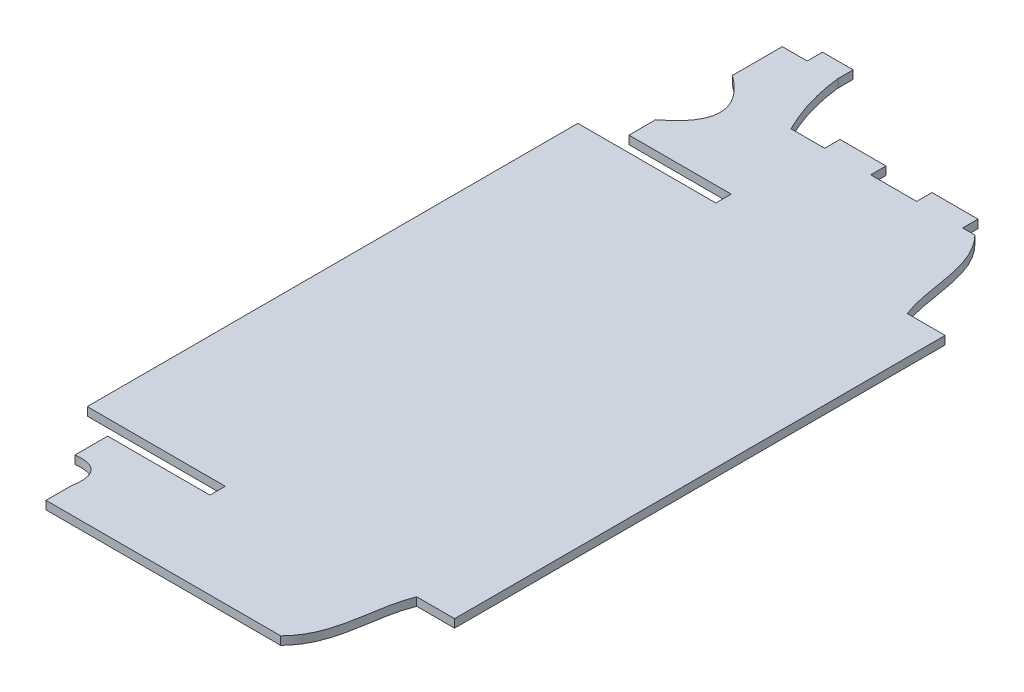
ISO-10303-21;
HEADER;
FILE_DESCRIPTION(('STEP AP214'),'2;1');
FILE_NAME('part.step','',(''),(''),'','','');
FILE_SCHEMA(('AUTOMOTIVE_DESIGN { 1 0 10303 214 1 1 1 1 }'));
ENDSEC;
DATA;
#1=APPLICATION_CONTEXT('core data for automotive mechanical design processes');
#2=APPLICATION_PROTOCOL_DEFINITION('international standard','automotive_design',2000,#1);
#3=PRODUCT_CONTEXT('',#1,'mechanical');
#4=PRODUCT('Part','Part','',(#3));
#5=PRODUCT_RELATED_PRODUCT_CATEGORY('part','',(#4));
#6=PRODUCT_DEFINITION_FORMATION('','',#4);
#7=PRODUCT_DEFINITION_CONTEXT('part definition',#1,'design');
#8=PRODUCT_DEFINITION('design','',#6,#7);
#9=PRODUCT_DEFINITION_SHAPE('','',#8);
#10=(LENGTH_UNIT() NAMED_UNIT(*) SI_UNIT(.MILLI.,.METRE.));
#11=(NAMED_UNIT(*) PLANE_ANGLE_UNIT() SI_UNIT($,.RADIAN.));
#12=(NAMED_UNIT(*) SI_UNIT($,.STERADIAN.) SOLID_ANGLE_UNIT());
#13=UNCERTAINTY_MEASURE_WITH_UNIT(LENGTH_MEASURE(1.E-05),#10,'distance_accuracy_value','');
#14=(GEOMETRIC_REPRESENTATION_CONTEXT(3) GLOBAL_UNCERTAINTY_ASSIGNED_CONTEXT((#13)) GLOBAL_UNIT_ASSIGNED_CONTEXT((#10,
#11,#12)) REPRESENTATION_CONTEXT('',''));
#15=CARTESIAN_POINT('',(0.,0.,0.));
#16=DIRECTION('',(0.,0.,1.));
#17=DIRECTION('',(1.,0.,0.));
#18=AXIS2_PLACEMENT_3D('',#15,#16,#17);
#19=CARTESIAN_POINT('',(0.,0.,-80.));
#20=DIRECTION('',(0.,0.,1.));
#21=DIRECTION('',(1.,0.,0.));
#22=AXIS2_PLACEMENT_3D('',#19,#20,#21);
#23=PLANE('',#22);
#24=DIRECTION('',(1.,0.,0.));
#25=VECTOR('',#24,1.);
#26=CARTESIAN_POINT('',(-69.6108312585417,-131.35,-80.));
#27=LINE('',#26,#25);
#28=CARTESIAN_POINT('',(-81.9486774272512,-131.35,-80.));
#29=VERTEX_POINT('',#28);
#30=CARTESIAN_POINT('',(-69.6108312585417,-131.35,-80.));
#31=VERTEX_POINT('',#30);
#32=EDGE_CURVE('E453',#29,#31,#27,.T.);
#33=ORIENTED_EDGE('',*,*,#32,.F.);
#34=DIRECTION('',(0.,1.,0.));
#35=VECTOR('',#34,1.);
#36=CARTESIAN_POINT('',(-81.9486774272512,-131.35,-80.));
#37=LINE('',#36,#35);
#38=CARTESIAN_POINT('',(-81.9486774272512,-128.65,-80.));
#39=VERTEX_POINT('',#38);
#40=EDGE_CURVE('E395',#29,#39,#37,.T.);
#41=ORIENTED_EDGE('',*,*,#40,.T.);
#42=DIRECTION('',(-1.,0.,0.));
#43=VECTOR('',#42,1.);
#44=CARTESIAN_POINT('',(-69.6108312585417,-128.65,-80.));
#45=LINE('',#44,#43);
#46=CARTESIAN_POINT('',(-69.6108312585417,-128.65,-80.));
#47=VERTEX_POINT('',#46);
#48=EDGE_CURVE('E462',#47,#39,#45,.T.);
#49=ORIENTED_EDGE('',*,*,#48,.F.);
#50=DIRECTION('',(0.,1.,0.));
#51=VECTOR('',#50,1.);
#52=CARTESIAN_POINT('',(-69.6108312585417,-131.35,-80.));
#53=LINE('',#52,#51);
#54=EDGE_CURVE('E455',#31,#47,#53,.T.);
#55=ORIENTED_EDGE('',*,*,#54,.F.);
#56=EDGE_LOOP('',(#33,#41,#49,#55));
#57=FACE_BOUND('',#56,.T.);
#58=ADVANCED_FACE('F39',(#57),#23,.F.);
#59=CARTESIAN_POINT('',(0.,0.,80.));
#60=DIRECTION('',(0.,0.,1.));
#61=DIRECTION('',(1.,0.,0.));
#62=AXIS2_PLACEMENT_3D('',#59,#60,#61);
#63=PLANE('',#62);
#64=DIRECTION('',(-1.,0.,0.));
#65=VECTOR('',#64,1.);
#66=CARTESIAN_POINT('',(-69.6108312585417,-128.65,80.));
#67=LINE('',#66,#65);
#68=CARTESIAN_POINT('',(-69.6108312585417,-128.65,80.));
#69=VERTEX_POINT('',#68);
#70=CARTESIAN_POINT('',(-81.9486774272512,-128.65,80.));
#71=VERTEX_POINT('',#70);
#72=EDGE_CURVE('E602',#69,#71,#67,.T.);
#73=ORIENTED_EDGE('',*,*,#72,.T.);
#74=DIRECTION('',(0.,1.,0.));
#75=VECTOR('',#74,1.);
#76=CARTESIAN_POINT('',(-81.9486774272512,-131.35,80.));
#77=LINE('',#76,#75);
#78=CARTESIAN_POINT('',(-81.9486774272512,-131.35,80.));
#79=VERTEX_POINT('',#78);
#80=EDGE_CURVE('E62',#79,#71,#77,.T.);
#81=ORIENTED_EDGE('',*,*,#80,.F.);
#82=DIRECTION('',(1.,0.,0.));
#83=VECTOR('',#82,1.);
#84=CARTESIAN_POINT('',(-69.6108312585417,-131.35,80.));
#85=LINE('',#84,#83);
#86=CARTESIAN_POINT('',(-69.6108312585417,-131.35,80.));
#87=VERTEX_POINT('',#86);
#88=EDGE_CURVE('E605',#79,#87,#85,.T.);
#89=ORIENTED_EDGE('',*,*,#88,.T.);
#90=DIRECTION('',(0.,1.,0.));
#91=VECTOR('',#90,1.);
#92=CARTESIAN_POINT('',(-69.6108312585417,-131.35,80.));
#93=LINE('',#92,#91);
#94=EDGE_CURVE('E461',#87,#69,#93,.T.);
#95=ORIENTED_EDGE('',*,*,#94,.T.);
#96=EDGE_LOOP('',(#73,#81,#89,#95));
#97=FACE_BOUND('',#96,.T.);
#98=ADVANCED_FACE('F428',(#97),#63,.T.);
#99=CARTESIAN_POINT('',(-69.6108312585417,-131.35,80.));
#100=DIRECTION('',(-1.,0.,0.));
#101=DIRECTION('',(0.,0.,1.));
#102=AXIS2_PLACEMENT_3D('',#99,#100,#101);
#103=PLANE('',#102);
#104=ORIENTED_EDGE('',*,*,#54,.T.);
#105=DIRECTION('',(0.,0.,-1.));
#106=VECTOR('',#105,1.);
#107=CARTESIAN_POINT('',(-69.6108312585417,-128.65,80.));
#108=LINE('',#107,#106);
#109=EDGE_CURVE('E11',#69,#47,#108,.T.);
#110=ORIENTED_EDGE('',*,*,#109,.F.);
#111=ORIENTED_EDGE('',*,*,#94,.F.);
#112=DIRECTION('',(0.,0.,-1.));
#113=VECTOR('',#112,1.);
#114=CARTESIAN_POINT('',(-69.6108312585417,-131.35,80.));
#115=LINE('',#114,#113);
#116=EDGE_CURVE('E466',#87,#31,#115,.T.);
#117=ORIENTED_EDGE('',*,*,#116,.T.);
#118=EDGE_LOOP('',(#104,#110,#111,#117));
#119=FACE_BOUND('',#118,.T.);
#120=ADVANCED_FACE('F41',(#119),#103,.F.);
#121=CARTESIAN_POINT('',(-69.6108312585417,-128.65,80.));
#122=DIRECTION('',(0.,-1.,0.));
#123=DIRECTION('',(1.,0.,0.));
#124=AXIS2_PLACEMENT_3D('',#121,#122,#123);
#125=PLANE('',#124);
#126=ORIENTED_EDGE('',*,*,#48,.T.);
#127=CARTESIAN_POINT('',(-81.9486774272512,-128.65,-80.));
#128=CARTESIAN_POINT('',(-86.3428101080022,-128.65,-90.9894453395637));
#129=CARTESIAN_POINT('',(-84.0042051124085,-128.65,-103.888102009332));
#130=CARTESIAN_POINT('',(-93.1057985545984,-128.65,-113.2));
#131=B_SPLINE_CURVE_WITH_KNOTS('',3,(#127,#128,#129,#130),.UNSPECIFIED.,.F.,.F.,(4,4),(0.,1.),.UNSPECIFIED.);
#132=CARTESIAN_POINT('',(-93.1057985545984,-128.65,-113.2));
#133=VERTEX_POINT('',#132);
#134=EDGE_CURVE('E308',#39,#133,#131,.T.);
#135=ORIENTED_EDGE('',*,*,#134,.T.);
#136=DIRECTION('',(-1.,0.,0.));
#137=VECTOR('',#136,1.);
#138=CARTESIAN_POINT('',(0.,-128.65,-113.2));
#139=LINE('',#138,#137);
#140=CARTESIAN_POINT('',(-97.1057985545984,-128.65,-113.2));
#141=VERTEX_POINT('',#140);
#142=EDGE_CURVE('E313',#133,#141,#139,.T.);
#143=ORIENTED_EDGE('',*,*,#142,.T.);
#144=DIRECTION('',(0.,0.,-1.));
#145=VECTOR('',#144,1.);
#146=CARTESIAN_POINT('',(-97.1057985545984,-128.65,0.));
#147=LINE('',#146,#145);
#148=CARTESIAN_POINT('',(-97.1057985545984,-128.65,-118.2));
#149=VERTEX_POINT('',#148);
#150=EDGE_CURVE('E319',#141,#149,#147,.T.);
#151=ORIENTED_EDGE('',*,*,#150,.T.);
#152=DIRECTION('',(-1.,0.,0.));
#153=VECTOR('',#152,1.);
#154=CARTESIAN_POINT('',(0.,-128.65,-118.2));
#155=LINE('',#154,#153);
#156=CARTESIAN_POINT('',(-112.105798554598,-128.65,-118.2));
#157=VERTEX_POINT('',#156);
#158=EDGE_CURVE('E322',#149,#157,#155,.T.);
#159=ORIENTED_EDGE('',*,*,#158,.T.);
#160=DIRECTION('',(0.,0.,-1.));
#161=VECTOR('',#160,1.);
#162=CARTESIAN_POINT('',(-112.105798554598,-128.65,0.));
#163=LINE('',#162,#161);
#164=CARTESIAN_POINT('',(-112.105798554598,-128.65,-113.2));
#165=VERTEX_POINT('',#164);
#166=EDGE_CURVE('E325',#165,#157,#163,.T.);
#167=ORIENTED_EDGE('',*,*,#166,.F.);
#168=DIRECTION('',(-1.,0.,0.));
#169=VECTOR('',#168,1.);
#170=CARTESIAN_POINT('',(0.,-128.65,-113.2));
#171=LINE('',#170,#169);
#172=CARTESIAN_POINT('',(-127.105798554598,-128.65,-113.2));
#173=VERTEX_POINT('',#172);
#174=EDGE_CURVE('E328',#165,#173,#171,.T.);
#175=ORIENTED_EDGE('',*,*,#174,.T.);
#176=DIRECTION('',(0.,0.,-1.));
#177=VECTOR('',#176,1.);
#178=CARTESIAN_POINT('',(-127.105798554598,-128.65,0.));
#179=LINE('',#178,#177);
#180=CARTESIAN_POINT('',(-127.105798554598,-128.65,-118.2));
#181=VERTEX_POINT('',#180);
#182=EDGE_CURVE('E331',#173,#181,#179,.T.);
#183=ORIENTED_EDGE('',*,*,#182,.T.);
#184=DIRECTION('',(-1.,0.,0.));
#185=VECTOR('',#184,1.);
#186=CARTESIAN_POINT('',(0.,-128.65,-118.2));
#187=LINE('',#186,#185);
#188=CARTESIAN_POINT('',(-142.105798554598,-128.65,-118.2));
#189=VERTEX_POINT('',#188);
#190=EDGE_CURVE('E334',#181,#189,#187,.T.);
#191=ORIENTED_EDGE('',*,*,#190,.T.);
#192=DIRECTION('',(0.,0.,-1.));
#193=VECTOR('',#192,1.);
#194=CARTESIAN_POINT('',(-142.105798554598,-128.65,0.));
#195=LINE('',#194,#193);
#196=CARTESIAN_POINT('',(-142.105798554598,-128.65,-113.2));
#197=VERTEX_POINT('',#196);
#198=EDGE_CURVE('E337',#197,#189,#195,.T.);
#199=ORIENTED_EDGE('',*,*,#198,.F.);
#200=DIRECTION('',(-1.,0.,0.));
#201=VECTOR('',#200,1.);
#202=CARTESIAN_POINT('',(0.,-128.65,-113.2));
#203=LINE('',#202,#201);
#204=CARTESIAN_POINT('',(-153.105798554598,-128.65,-113.2));
#205=VERTEX_POINT('',#204);
#206=EDGE_CURVE('E340',#197,#205,#203,.T.);
#207=ORIENTED_EDGE('',*,*,#206,.T.);
#208=CARTESIAN_POINT('',(-153.105798554598,-128.65,-113.2));
#209=CARTESIAN_POINT('',(-158.310437450706,-128.65,-123.519674564789));
#210=CARTESIAN_POINT('',(-159.620228805017,-128.65,-135.));
#211=B_SPLINE_CURVE_WITH_KNOTS('',2,(#208,#209,#210),.UNSPECIFIED.,.F.,.F.,(3,3),(0.,1.),.UNSPECIFIED.);
#212=CARTESIAN_POINT('',(-159.620228805017,-128.65,-135.));
#213=VERTEX_POINT('',#212);
#214=EDGE_CURVE('E343',#205,#213,#211,.T.);
#215=ORIENTED_EDGE('',*,*,#214,.T.);
#216=DIRECTION('',(0.,0.,-1.));
#217=VECTOR('',#216,1.);
#218=CARTESIAN_POINT('',(-159.620228805017,-128.65,0.));
#219=LINE('',#218,#217);
#220=CARTESIAN_POINT('',(-159.620228805017,-128.65,-140.));
#221=VERTEX_POINT('',#220);
#222=EDGE_CURVE('E348',#213,#221,#219,.T.);
#223=ORIENTED_EDGE('',*,*,#222,.T.);
#224=DIRECTION('',(-1.,0.,0.));
#225=VECTOR('',#224,1.);
#226=CARTESIAN_POINT('',(0.,-128.65,-140.));
#227=LINE('',#226,#225);
#228=CARTESIAN_POINT('',(-169.620228805017,-128.65,-140.));
#229=VERTEX_POINT('',#228);
#230=EDGE_CURVE('E354',#221,#229,#227,.T.);
#231=ORIENTED_EDGE('',*,*,#230,.T.);
#232=DIRECTION('',(0.,0.,-1.));
#233=VECTOR('',#232,1.);
#234=CARTESIAN_POINT('',(-169.620228805017,-128.65,0.));
#235=LINE('',#234,#233);
#236=CARTESIAN_POINT('',(-169.620228805017,-128.65,-135.));
#237=VERTEX_POINT('',#236);
#238=EDGE_CURVE('E357',#237,#229,#235,.T.);
#239=ORIENTED_EDGE('',*,*,#238,.F.);
#240=DIRECTION('',(-1.,0.,0.));
#241=VECTOR('',#240,1.);
#242=CARTESIAN_POINT('',(0.,-128.65,-135.));
#243=LINE('',#242,#241);
#244=CARTESIAN_POINT('',(-177.731759245656,-128.65,-135.));
#245=VERTEX_POINT('',#244);
#246=EDGE_CURVE('E360',#237,#245,#243,.T.);
#247=ORIENTED_EDGE('',*,*,#246,.T.);
#248=DIRECTION('',(0.,0.,1.));
#249=VECTOR('',#248,1.);
#250=CARTESIAN_POINT('',(-177.731759245656,-128.65,0.));
#251=LINE('',#250,#249);
#252=CARTESIAN_POINT('',(-177.731759245656,-128.65,-118.728473065772));
#253=VERTEX_POINT('',#252);
#254=EDGE_CURVE('E275',#245,#253,#251,.T.);
#255=ORIENTED_EDGE('',*,*,#254,.T.);
#256=CARTESIAN_POINT('',(-177.731759245656,-128.65,-93.7029857066853));
#257=CARTESIAN_POINT('',(-160.836478184189,-128.65,-106.395581302732));
#258=CARTESIAN_POINT('',(-177.731759245656,-128.65,-118.728473065772));
#259=B_SPLINE_CURVE_WITH_KNOTS('',2,(#256,#257,#258),.UNSPECIFIED.,.F.,.F.,(3,3),(0.,1.),.UNSPECIFIED.);
#260=CARTESIAN_POINT('',(-177.731759245656,-128.65,-93.7029857066853));
#261=VERTEX_POINT('',#260);
#262=EDGE_CURVE('E297',#261,#253,#259,.T.);
#263=ORIENTED_EDGE('',*,*,#262,.F.);
#264=CARTESIAN_POINT('',(-177.731759245656,-128.65,-85.));
#265=VERTEX_POINT('',#264);
#266=EDGE_CURVE('E261',#261,#265,#251,.T.);
#267=ORIENTED_EDGE('',*,*,#266,.T.);
#268=DIRECTION('',(1.,0.,0.));
#269=VECTOR('',#268,1.);
#270=CARTESIAN_POINT('',(0.,-128.65,-85.));
#271=LINE('',#270,#269);
#272=CARTESIAN_POINT('',(-144.39503941317,-128.65,-85.));
#273=VERTEX_POINT('',#272);
#274=EDGE_CURVE('E305',#265,#273,#271,.T.);
#275=ORIENTED_EDGE('',*,*,#274,.T.);
#276=DIRECTION('',(0.,0.,1.));
#277=VECTOR('',#276,1.);
#278=CARTESIAN_POINT('',(-144.39503941317,-128.65,0.));
#279=LINE('',#278,#277);
#280=CARTESIAN_POINT('',(-144.39503941317,-128.65,-80.));
#281=VERTEX_POINT('',#280);
#282=EDGE_CURVE('E54',#273,#281,#279,.T.);
#283=ORIENTED_EDGE('',*,*,#282,.T.);
#284=CARTESIAN_POINT('',(-189.39503941317,-128.65,-80.));
#285=VERTEX_POINT('',#284);
#286=EDGE_CURVE('E480',#281,#285,#45,.T.);
#287=ORIENTED_EDGE('',*,*,#286,.T.);
#288=DIRECTION('',(0.,0.,-1.));
#289=VECTOR('',#288,1.);
#290=CARTESIAN_POINT('',(-189.39503941317,-128.65,80.));
#291=LINE('',#290,#289);
#292=CARTESIAN_POINT('',(-189.39503941317,-128.65,80.));
#293=VERTEX_POINT('',#292);
#294=EDGE_CURVE('E47',#293,#285,#291,.T.);
#295=ORIENTED_EDGE('',*,*,#294,.F.);
#296=CARTESIAN_POINT('',(-144.39503941317,-128.65,80.));
#297=VERTEX_POINT('',#296);
#298=EDGE_CURVE('E601',#297,#293,#67,.T.);
#299=ORIENTED_EDGE('',*,*,#298,.F.);
#300=DIRECTION('',(0.,0.,-1.));
#301=VECTOR('',#300,1.);
#302=CARTESIAN_POINT('',(-144.39503941317,-128.65,0.));
#303=LINE('',#302,#301);
#304=CARTESIAN_POINT('',(-144.39503941317,-128.65,85.));
#305=VERTEX_POINT('',#304);
#306=EDGE_CURVE('E572',#305,#297,#303,.T.);
#307=ORIENTED_EDGE('',*,*,#306,.F.);
#308=DIRECTION('',(1.,0.,0.));
#309=VECTOR('',#308,1.);
#310=CARTESIAN_POINT('',(-1.38811251637723E-13,-128.65,85.0000000000002));
#311=LINE('',#310,#309);
#312=CARTESIAN_POINT('',(-177.731759245656,-128.65,85.));
#313=VERTEX_POINT('',#312);
#314=EDGE_CURVE('E578',#313,#305,#311,.T.);
#315=ORIENTED_EDGE('',*,*,#314,.F.);
#316=DIRECTION('',(0.,0.,1.));
#317=VECTOR('',#316,1.);
#318=CARTESIAN_POINT('',(-177.731759245658,-128.65,3.24344956727036E-12));
#319=LINE('',#318,#317);
#320=CARTESIAN_POINT('',(-177.731759245656,-128.65,95.6464830931076));
#321=VERTEX_POINT('',#320);
#322=EDGE_CURVE('E409',#313,#321,#319,.T.);
#323=ORIENTED_EDGE('',*,*,#322,.T.);
#324=CARTESIAN_POINT('',(-169.648055860722,-128.65,105.087652523409));
#325=CARTESIAN_POINT('',(-167.760228738437,-128.65,94.5141973413869));
#326=CARTESIAN_POINT('',(-177.731759245656,-128.65,95.6464830931076));
#327=B_SPLINE_CURVE_WITH_KNOTS('',2,(#324,#325,#326),.UNSPECIFIED.,.F.,.F.,(3,3),(0.,1.),.UNSPECIFIED.);
#328=CARTESIAN_POINT('',(-169.648055860722,-128.65,105.087652523409));
#329=VERTEX_POINT('',#328);
#330=EDGE_CURVE('E364',#329,#321,#327,.T.);
#331=ORIENTED_EDGE('',*,*,#330,.F.);
#332=DIRECTION('',(0.,0.,1.));
#333=VECTOR('',#332,1.);
#334=CARTESIAN_POINT('',(-169.648055860722,-128.65,0.));
#335=LINE('',#334,#333);
#336=CARTESIAN_POINT('',(-169.648055860722,-128.65,113.2));
#337=VERTEX_POINT('',#336);
#338=EDGE_CURVE('E559',#329,#337,#335,.T.);
#339=ORIENTED_EDGE('',*,*,#338,.T.);
#340=DIRECTION('',(-1.,0.,0.));
#341=VECTOR('',#340,1.);
#342=CARTESIAN_POINT('',(0.,-128.65,113.2));
#343=LINE('',#342,#341);
#344=CARTESIAN_POINT('',(-93.1057985545984,-128.65,113.2));
#345=VERTEX_POINT('',#344);
#346=EDGE_CURVE('E565',#345,#337,#343,.T.);
#347=ORIENTED_EDGE('',*,*,#346,.F.);
#348=CARTESIAN_POINT('',(-81.9486774272512,-128.65,80.));
#349=CARTESIAN_POINT('',(-86.3428101080022,-128.65,90.9894453395638));
#350=CARTESIAN_POINT('',(-84.0042051124085,-128.65,103.888102009332));
#351=CARTESIAN_POINT('',(-93.1057985545984,-128.65,113.2));
#352=B_SPLINE_CURVE_WITH_KNOTS('',3,(#348,#349,#350,#351),.UNSPECIFIED.,.F.,.F.,(4,4),(0.,1.),.UNSPECIFIED.);
#353=EDGE_CURVE('E568',#71,#345,#352,.T.);
#354=ORIENTED_EDGE('',*,*,#353,.F.);
#355=ORIENTED_EDGE('',*,*,#72,.F.);
#356=ORIENTED_EDGE('',*,*,#109,.T.);
#357=EDGE_LOOP('',(#126,#135,#143,#151,#159,#167,#175,#183,#191,#199,#207,#215,#223,#231,#239,
#247,#255,#263,#267,#275,#283,#287,#295,#299,#307,#315,#323,#331,#339,#347,#354,#355,#356));
#358=FACE_BOUND('',#357,.T.);
#359=ADVANCED_FACE('F436',(#358),#125,.F.);
#360=CARTESIAN_POINT('',(-189.39503941317,-131.35,80.));
#361=DIRECTION('',(1.,0.,0.));
#362=DIRECTION('',(0.,0.,-1.));
#363=AXIS2_PLACEMENT_3D('',#360,#361,#362);
#364=PLANE('',#363);
#365=DIRECTION('',(0.,-1.,0.));
#366=VECTOR('',#365,1.);
#367=CARTESIAN_POINT('',(-189.39503941317,-131.35,-80.));
#368=LINE('',#367,#366);
#369=CARTESIAN_POINT('',(-189.39503941317,-131.35,-80.));
#370=VERTEX_POINT('',#369);
#371=EDGE_CURVE('E459',#285,#370,#368,.T.);
#372=ORIENTED_EDGE('',*,*,#371,.T.);
#373=DIRECTION('',(0.,0.,-1.));
#374=VECTOR('',#373,1.);
#375=CARTESIAN_POINT('',(-189.39503941317,-131.35,80.));
#376=LINE('',#375,#374);
#377=CARTESIAN_POINT('',(-189.39503941317,-131.35,80.));
#378=VERTEX_POINT('',#377);
#379=EDGE_CURVE('E468',#378,#370,#376,.T.);
#380=ORIENTED_EDGE('',*,*,#379,.F.);
#381=DIRECTION('',(0.,-1.,0.));
#382=VECTOR('',#381,1.);
#383=CARTESIAN_POINT('',(-189.39503941317,-131.35,80.));
#384=LINE('',#383,#382);
#385=EDGE_CURVE('E476',#293,#378,#384,.T.);
#386=ORIENTED_EDGE('',*,*,#385,.F.);
#387=ORIENTED_EDGE('',*,*,#294,.T.);
#388=EDGE_LOOP('',(#372,#380,#386,#387));
#389=FACE_BOUND('',#388,.T.);
#390=ADVANCED_FACE('F434',(#389),#364,.F.);
#391=CARTESIAN_POINT('',(-69.6108312585417,-131.35,80.));
#392=DIRECTION('',(0.,1.,0.));
#393=DIRECTION('',(-1.,0.,0.));
#394=AXIS2_PLACEMENT_3D('',#391,#392,#393);
#395=PLANE('',#394);
#396=CARTESIAN_POINT('',(-81.9486774272512,-131.35,-80.));
#397=CARTESIAN_POINT('',(-86.3428101080022,-131.35,-90.9894453395637));
#398=CARTESIAN_POINT('',(-84.0042051124085,-131.35,-103.888102009332));
#399=CARTESIAN_POINT('',(-93.1057985545984,-131.35,-113.2));
#400=B_SPLINE_CURVE_WITH_KNOTS('',3,(#396,#397,#398,#399),.UNSPECIFIED.,.F.,.F.,(4,4),(0.,1.),.UNSPECIFIED.);
#401=CARTESIAN_POINT('',(-93.1057985545984,-131.35,-113.2));
#402=VERTEX_POINT('',#401);
#403=EDGE_CURVE('E485',#29,#402,#400,.T.);
#404=ORIENTED_EDGE('',*,*,#403,.F.);
#405=ORIENTED_EDGE('',*,*,#32,.T.);
#406=ORIENTED_EDGE('',*,*,#116,.F.);
#407=ORIENTED_EDGE('',*,*,#88,.F.);
#408=CARTESIAN_POINT('',(-81.9486774272512,-131.35,80.));
#409=CARTESIAN_POINT('',(-86.3428101080022,-131.35,90.9894453395638));
#410=CARTESIAN_POINT('',(-84.0042051124085,-131.35,103.888102009332));
#411=CARTESIAN_POINT('',(-93.1057985545984,-131.35,113.2));
#412=B_SPLINE_CURVE_WITH_KNOTS('',3,(#408,#409,#410,#411),.UNSPECIFIED.,.F.,.F.,(4,4),(0.,1.),.UNSPECIFIED.);
#413=CARTESIAN_POINT('',(-93.1057985545984,-131.35,113.2));
#414=VERTEX_POINT('',#413);
#415=EDGE_CURVE('E537',#79,#414,#412,.T.);
#416=ORIENTED_EDGE('',*,*,#415,.T.);
#417=DIRECTION('',(-1.,0.,0.));
#418=VECTOR('',#417,1.);
#419=CARTESIAN_POINT('',(0.,-131.35,113.2));
#420=LINE('',#419,#418);
#421=CARTESIAN_POINT('',(-169.648055860722,-131.35,113.2));
#422=VERTEX_POINT('',#421);
#423=EDGE_CURVE('E543',#414,#422,#420,.T.);
#424=ORIENTED_EDGE('',*,*,#423,.T.);
#425=DIRECTION('',(0.,0.,1.));
#426=VECTOR('',#425,1.);
#427=CARTESIAN_POINT('',(-169.648055860722,-131.35,0.));
#428=LINE('',#427,#426);
#429=CARTESIAN_POINT('',(-169.648055860722,-131.35,105.087652523409));
#430=VERTEX_POINT('',#429);
#431=EDGE_CURVE('E408',#430,#422,#428,.T.);
#432=ORIENTED_EDGE('',*,*,#431,.F.);
#433=CARTESIAN_POINT('',(-169.648055860722,-131.35,105.087652523409));
#434=CARTESIAN_POINT('',(-167.760228738437,-131.35,94.5141973413869));
#435=CARTESIAN_POINT('',(-177.731759245656,-131.35,95.6464830931076));
#436=B_SPLINE_CURVE_WITH_KNOTS('',2,(#433,#434,#435),.UNSPECIFIED.,.F.,.F.,(3,3),(0.,1.),.UNSPECIFIED.);
#437=CARTESIAN_POINT('',(-177.731759245656,-131.35,95.6464830931076));
#438=VERTEX_POINT('',#437);
#439=EDGE_CURVE('E403',#430,#438,#436,.T.);
#440=ORIENTED_EDGE('',*,*,#439,.T.);
#441=DIRECTION('',(0.,0.,1.));
#442=VECTOR('',#441,1.);
#443=CARTESIAN_POINT('',(-177.731759245658,-131.35,3.24344956727036E-12));
#444=LINE('',#443,#442);
#445=CARTESIAN_POINT('',(-177.731759245656,-131.35,85.));
#446=VERTEX_POINT('',#445);
#447=EDGE_CURVE('E551',#446,#438,#444,.T.);
#448=ORIENTED_EDGE('',*,*,#447,.F.);
#449=DIRECTION('',(1.,0.,0.));
#450=VECTOR('',#449,1.);
#451=CARTESIAN_POINT('',(-1.39436877129737E-13,-131.35,85.0000000000002));
#452=LINE('',#451,#450);
#453=CARTESIAN_POINT('',(-144.39503941317,-131.35,85.));
#454=VERTEX_POINT('',#453);
#455=EDGE_CURVE('E549',#446,#454,#452,.T.);
#456=ORIENTED_EDGE('',*,*,#455,.T.);
#457=DIRECTION('',(0.,0.,-1.));
#458=VECTOR('',#457,1.);
#459=CARTESIAN_POINT('',(-144.39503941317,-131.35,0.));
#460=LINE('',#459,#458);
#461=CARTESIAN_POINT('',(-144.39503941317,-131.35,80.));
#462=VERTEX_POINT('',#461);
#463=EDGE_CURVE('E542',#454,#462,#460,.T.);
#464=ORIENTED_EDGE('',*,*,#463,.T.);
#465=EDGE_CURVE('E469',#378,#462,#85,.T.);
#466=ORIENTED_EDGE('',*,*,#465,.F.);
#467=ORIENTED_EDGE('',*,*,#379,.T.);
#468=CARTESIAN_POINT('',(-144.39503941317,-131.35,-80.));
#469=VERTEX_POINT('',#468);
#470=EDGE_CURVE('E458',#370,#469,#27,.T.);
#471=ORIENTED_EDGE('',*,*,#470,.T.);
#472=DIRECTION('',(0.,0.,1.));
#473=VECTOR('',#472,1.);
#474=CARTESIAN_POINT('',(-144.39503941317,-131.35,0.));
#475=LINE('',#474,#473);
#476=CARTESIAN_POINT('',(-144.39503941317,-131.35,-85.));
#477=VERTEX_POINT('',#476);
#478=EDGE_CURVE('E284',#477,#469,#475,.T.);
#479=ORIENTED_EDGE('',*,*,#478,.F.);
#480=DIRECTION('',(1.,0.,0.));
#481=VECTOR('',#480,1.);
#482=CARTESIAN_POINT('',(0.,-131.35,-85.));
#483=LINE('',#482,#481);
#484=CARTESIAN_POINT('',(-177.731759245656,-131.35,-85.));
#485=VERTEX_POINT('',#484);
#486=EDGE_CURVE('E282',#485,#477,#483,.T.);
#487=ORIENTED_EDGE('',*,*,#486,.F.);
#488=DIRECTION('',(0.,0.,1.));
#489=VECTOR('',#488,1.);
#490=CARTESIAN_POINT('',(-177.731759245656,-131.35,0.));
#491=LINE('',#490,#489);
#492=CARTESIAN_POINT('',(-177.731759245656,-131.35,-93.7029857066853));
#493=VERTEX_POINT('',#492);
#494=EDGE_CURVE('E259',#493,#485,#491,.T.);
#495=ORIENTED_EDGE('',*,*,#494,.F.);
#496=CARTESIAN_POINT('',(-177.731759245656,-131.35,-93.7029857066853));
#497=CARTESIAN_POINT('',(-160.836478184189,-131.35,-106.395581302732));
#498=CARTESIAN_POINT('',(-177.731759245656,-131.35,-118.728473065772));
#499=B_SPLINE_CURVE_WITH_KNOTS('',2,(#496,#497,#498),.UNSPECIFIED.,.F.,.F.,(3,3),(0.,1.),.UNSPECIFIED.);
#500=CARTESIAN_POINT('',(-177.731759245656,-131.35,-118.728473065772));
#501=VERTEX_POINT('',#500);
#502=EDGE_CURVE('E269',#493,#501,#499,.T.);
#503=ORIENTED_EDGE('',*,*,#502,.T.);
#504=CARTESIAN_POINT('',(-177.731759245656,-131.35,-135.));
#505=VERTEX_POINT('',#504);
#506=EDGE_CURVE('E266',#505,#501,#491,.T.);
#507=ORIENTED_EDGE('',*,*,#506,.F.);
#508=DIRECTION('',(-1.,0.,0.));
#509=VECTOR('',#508,1.);
#510=CARTESIAN_POINT('',(0.,-131.35,-135.));
#511=LINE('',#510,#509);
#512=CARTESIAN_POINT('',(-169.620228805017,-131.35,-135.));
#513=VERTEX_POINT('',#512);
#514=EDGE_CURVE('E286',#513,#505,#511,.T.);
#515=ORIENTED_EDGE('',*,*,#514,.F.);
#516=DIRECTION('',(0.,0.,-1.));
#517=VECTOR('',#516,1.);
#518=CARTESIAN_POINT('',(-169.620228805017,-131.35,0.));
#519=LINE('',#518,#517);
#520=CARTESIAN_POINT('',(-169.620228805017,-131.35,-140.));
#521=VERTEX_POINT('',#520);
#522=EDGE_CURVE('E289',#513,#521,#519,.T.);
#523=ORIENTED_EDGE('',*,*,#522,.T.);
#524=DIRECTION('',(-1.,0.,0.));
#525=VECTOR('',#524,1.);
#526=CARTESIAN_POINT('',(0.,-131.35,-140.));
#527=LINE('',#526,#525);
#528=CARTESIAN_POINT('',(-159.620228805017,-131.35,-140.));
#529=VERTEX_POINT('',#528);
#530=EDGE_CURVE('E293',#529,#521,#527,.T.);
#531=ORIENTED_EDGE('',*,*,#530,.F.);
#532=DIRECTION('',(0.,0.,-1.));
#533=VECTOR('',#532,1.);
#534=CARTESIAN_POINT('',(-159.620228805017,-131.35,0.));
#535=LINE('',#534,#533);
#536=CARTESIAN_POINT('',(-159.620228805017,-131.35,-135.));
#537=VERTEX_POINT('',#536);
#538=EDGE_CURVE('E994',#537,#529,#535,.T.);
#539=ORIENTED_EDGE('',*,*,#538,.F.);
#540=CARTESIAN_POINT('',(-153.105798554598,-131.35,-113.2));
#541=CARTESIAN_POINT('',(-158.310437450706,-131.35,-123.519674564789));
#542=CARTESIAN_POINT('',(-159.620228805017,-131.35,-135.));
#543=B_SPLINE_CURVE_WITH_KNOTS('',2,(#540,#541,#542),.UNSPECIFIED.,.F.,.F.,(3,3),(0.,1.),.UNSPECIFIED.);
#544=CARTESIAN_POINT('',(-153.105798554598,-131.35,-113.2));
#545=VERTEX_POINT('',#544);
#546=EDGE_CURVE('E987',#545,#537,#543,.T.);
#547=ORIENTED_EDGE('',*,*,#546,.F.);
#548=DIRECTION('',(-1.,0.,0.));
#549=VECTOR('',#548,1.);
#550=CARTESIAN_POINT('',(0.,-131.35,-113.2));
#551=LINE('',#550,#549);
#552=CARTESIAN_POINT('',(-142.105798554598,-131.35,-113.2));
#553=VERTEX_POINT('',#552);
#554=EDGE_CURVE('E995',#553,#545,#551,.T.);
#555=ORIENTED_EDGE('',*,*,#554,.F.);
#556=DIRECTION('',(0.,0.,-1.));
#557=VECTOR('',#556,1.);
#558=CARTESIAN_POINT('',(-142.105798554598,-131.35,0.));
#559=LINE('',#558,#557);
#560=CARTESIAN_POINT('',(-142.105798554598,-131.35,-118.2));
#561=VERTEX_POINT('',#560);
#562=EDGE_CURVE('E1014',#553,#561,#559,.T.);
#563=ORIENTED_EDGE('',*,*,#562,.T.);
#564=DIRECTION('',(-1.,0.,0.));
#565=VECTOR('',#564,1.);
#566=CARTESIAN_POINT('',(0.,-131.35,-118.2));
#567=LINE('',#566,#565);
#568=CARTESIAN_POINT('',(-127.105798554598,-131.35,-118.2));
#569=VERTEX_POINT('',#568);
#570=EDGE_CURVE('E1015',#569,#561,#567,.T.);
#571=ORIENTED_EDGE('',*,*,#570,.F.);
#572=DIRECTION('',(0.,0.,-1.));
#573=VECTOR('',#572,1.);
#574=CARTESIAN_POINT('',(-127.105798554598,-131.35,0.));
#575=LINE('',#574,#573);
#576=CARTESIAN_POINT('',(-127.105798554598,-131.35,-113.2));
#577=VERTEX_POINT('',#576);
#578=EDGE_CURVE('E1019',#577,#569,#575,.T.);
#579=ORIENTED_EDGE('',*,*,#578,.F.);
#580=DIRECTION('',(-1.,0.,0.));
#581=VECTOR('',#580,1.);
#582=CARTESIAN_POINT('',(0.,-131.35,-113.2));
#583=LINE('',#582,#581);
#584=CARTESIAN_POINT('',(-112.105798554598,-131.35,-113.2));
#585=VERTEX_POINT('',#584);
#586=EDGE_CURVE('E1024',#585,#577,#583,.T.);
#587=ORIENTED_EDGE('',*,*,#586,.F.);
#588=DIRECTION('',(0.,0.,-1.));
#589=VECTOR('',#588,1.);
#590=CARTESIAN_POINT('',(-112.105798554598,-131.35,0.));
#591=LINE('',#590,#589);
#592=CARTESIAN_POINT('',(-112.105798554598,-131.35,-118.2));
#593=VERTEX_POINT('',#592);
#594=EDGE_CURVE('E1027',#585,#593,#591,.T.);
#595=ORIENTED_EDGE('',*,*,#594,.T.);
#596=DIRECTION('',(-1.,0.,0.));
#597=VECTOR('',#596,1.);
#598=CARTESIAN_POINT('',(0.,-131.35,-118.2));
#599=LINE('',#598,#597);
#600=CARTESIAN_POINT('',(-97.1057985545984,-131.35,-118.2));
#601=VERTEX_POINT('',#600);
#602=EDGE_CURVE('E1029',#601,#593,#599,.T.);
#603=ORIENTED_EDGE('',*,*,#602,.F.);
#604=DIRECTION('',(0.,0.,-1.));
#605=VECTOR('',#604,1.);
#606=CARTESIAN_POINT('',(-97.1057985545984,-131.35,0.));
#607=LINE('',#606,#605);
#608=CARTESIAN_POINT('',(-97.1057985545984,-131.35,-113.2));
#609=VERTEX_POINT('',#608);
#610=EDGE_CURVE('E1031',#609,#601,#607,.T.);
#611=ORIENTED_EDGE('',*,*,#610,.F.);
#612=DIRECTION('',(-1.,0.,0.));
#613=VECTOR('',#612,1.);
#614=CARTESIAN_POINT('',(0.,-131.35,-113.2));
#615=LINE('',#614,#613);
#616=EDGE_CURVE('E488',#402,#609,#615,.T.);
#617=ORIENTED_EDGE('',*,*,#616,.F.);
#618=EDGE_LOOP('',(#404,#405,#406,#407,#416,#424,#432,#440,#448,#456,#464,#466,#467,#471,#479,
#487,#495,#503,#507,#515,#523,#531,#539,#547,#555,#563,#571,#579,#587,#595,#603,#611,#617));
#619=FACE_BOUND('',#618,.T.);
#620=ADVANCED_FACE('F279',(#619),#395,.F.);
#621=ORIENTED_EDGE('',*,*,#465,.T.);
#622=DIRECTION('',(0.,1.,0.));
#623=VECTOR('',#622,1.);
#624=CARTESIAN_POINT('',(-144.39503941317,-131.35,80.));
#625=LINE('',#624,#623);
#626=EDGE_CURVE('E589',#462,#297,#625,.T.);
#627=ORIENTED_EDGE('',*,*,#626,.T.);
#628=ORIENTED_EDGE('',*,*,#298,.T.);
#629=ORIENTED_EDGE('',*,*,#385,.T.);
#630=EDGE_LOOP('',(#621,#627,#628,#629));
#631=FACE_BOUND('',#630,.T.);
#632=ADVANCED_FACE('F424',(#631),#63,.T.);
#633=ORIENTED_EDGE('',*,*,#371,.F.);
#634=ORIENTED_EDGE('',*,*,#286,.F.);
#635=DIRECTION('',(0.,1.,0.));
#636=VECTOR('',#635,1.);
#637=CARTESIAN_POINT('',(-144.39503941317,-131.35,-80.));
#638=LINE('',#637,#636);
#639=EDGE_CURVE('E398',#469,#281,#638,.T.);
#640=ORIENTED_EDGE('',*,*,#639,.F.);
#641=ORIENTED_EDGE('',*,*,#470,.F.);
#642=EDGE_LOOP('',(#633,#634,#640,#641));
#643=FACE_BOUND('',#642,.T.);
#644=ADVANCED_FACE('F420',(#643),#23,.F.);
#645=DIRECTION('',(0.,1.,0.));
#646=VECTOR('',#645,1.);
#647=SURFACE_OF_LINEAR_EXTRUSION('',#436,#646);
#648=ORIENTED_EDGE('',*,*,#330,.T.);
#649=DIRECTION('',(0.,1.,0.));
#650=VECTOR('',#649,1.);
#651=CARTESIAN_POINT('',(-177.731759245656,-131.35,95.6464830931076));
#652=LINE('',#651,#650);
#653=EDGE_CURVE('E582',#438,#321,#652,.T.);
#654=ORIENTED_EDGE('',*,*,#653,.F.);
#655=ORIENTED_EDGE('',*,*,#439,.F.);
#656=DIRECTION('',(0.,1.,0.));
#657=VECTOR('',#656,1.);
#658=CARTESIAN_POINT('',(-169.648055860722,-131.35,105.087652523409));
#659=LINE('',#658,#657);
#660=EDGE_CURVE('E554',#430,#329,#659,.T.);
#661=ORIENTED_EDGE('',*,*,#660,.T.);
#662=EDGE_LOOP('',(#648,#654,#655,#661));
#663=FACE_BOUND('',#662,.T.);
#664=ADVANCED_FACE('F415',(#663),#647,.F.);
#665=CARTESIAN_POINT('',(-177.731759245658,-131.35,3.24344956727036E-12));
#666=DIRECTION('',(-1.,0.,0.));
#667=DIRECTION('',(0.,0.,1.));
#668=AXIS2_PLACEMENT_3D('',#665,#666,#667);
#669=PLANE('',#668);
#670=ORIENTED_EDGE('',*,*,#322,.F.);
#671=DIRECTION('',(0.,1.,0.));
#672=VECTOR('',#671,1.);
#673=CARTESIAN_POINT('',(-177.731759245656,-131.35,85.));
#674=LINE('',#673,#672);
#675=EDGE_CURVE('E584',#446,#313,#674,.T.);
#676=ORIENTED_EDGE('',*,*,#675,.F.);
#677=ORIENTED_EDGE('',*,*,#447,.T.);
#678=ORIENTED_EDGE('',*,*,#653,.T.);
#679=EDGE_LOOP('',(#670,#676,#677,#678));
#680=FACE_BOUND('',#679,.T.);
#681=ADVANCED_FACE('F419',(#680),#669,.T.);
#682=CARTESIAN_POINT('',(-1.39436877129737E-13,-131.35,85.0000000000002));
#683=DIRECTION('',(0.,0.,1.));
#684=DIRECTION('',(1.,0.,0.));
#685=AXIS2_PLACEMENT_3D('',#682,#683,#684);
#686=PLANE('',#685);
#687=ORIENTED_EDGE('',*,*,#314,.T.);
#688=DIRECTION('',(0.,1.,0.));
#689=VECTOR('',#688,1.);
#690=CARTESIAN_POINT('',(-144.39503941317,-131.35,85.));
#691=LINE('',#690,#689);
#692=EDGE_CURVE('E586',#454,#305,#691,.T.);
#693=ORIENTED_EDGE('',*,*,#692,.F.);
#694=ORIENTED_EDGE('',*,*,#455,.F.);
#695=ORIENTED_EDGE('',*,*,#675,.T.);
#696=EDGE_LOOP('',(#687,#693,#694,#695));
#697=FACE_BOUND('',#696,.T.);
#698=ADVANCED_FACE('F523',(#697),#686,.F.);
#699=CARTESIAN_POINT('',(-144.39503941317,-131.35,0.));
#700=DIRECTION('',(1.,0.,0.));
#701=DIRECTION('',(0.,1.,0.));
#702=AXIS2_PLACEMENT_3D('',#699,#700,#701);
#703=PLANE('',#702);
#704=ORIENTED_EDGE('',*,*,#306,.T.);
#705=ORIENTED_EDGE('',*,*,#626,.F.);
#706=ORIENTED_EDGE('',*,*,#463,.F.);
#707=ORIENTED_EDGE('',*,*,#692,.T.);
#708=EDGE_LOOP('',(#704,#705,#706,#707));
#709=FACE_BOUND('',#708,.T.);
#710=ADVANCED_FACE('F527',(#709),#703,.F.);
#711=DIRECTION('',(0.,1.,0.));
#712=VECTOR('',#711,1.);
#713=SURFACE_OF_LINEAR_EXTRUSION('',#412,#712);
#714=ORIENTED_EDGE('',*,*,#353,.T.);
#715=DIRECTION('',(0.,1.,0.));
#716=VECTOR('',#715,1.);
#717=CARTESIAN_POINT('',(-93.1057985545984,-131.35,113.2));
#718=LINE('',#717,#716);
#719=EDGE_CURVE('E593',#414,#345,#718,.T.);
#720=ORIENTED_EDGE('',*,*,#719,.F.);
#721=ORIENTED_EDGE('',*,*,#415,.F.);
#722=ORIENTED_EDGE('',*,*,#80,.T.);
#723=EDGE_LOOP('',(#714,#720,#721,#722));
#724=FACE_BOUND('',#723,.T.);
#725=ADVANCED_FACE('F531',(#724),#713,.F.);
#726=CARTESIAN_POINT('',(0.,-131.35,113.2));
#727=DIRECTION('',(0.,0.,-1.));
#728=DIRECTION('',(-1.,0.,0.));
#729=AXIS2_PLACEMENT_3D('',#726,#727,#728);
#730=PLANE('',#729);
#731=ORIENTED_EDGE('',*,*,#346,.T.);
#732=DIRECTION('',(0.,1.,0.));
#733=VECTOR('',#732,1.);
#734=CARTESIAN_POINT('',(-169.648055860722,-131.35,113.2));
#735=LINE('',#734,#733);
#736=EDGE_CURVE('E596',#422,#337,#735,.T.);
#737=ORIENTED_EDGE('',*,*,#736,.F.);
#738=ORIENTED_EDGE('',*,*,#423,.F.);
#739=ORIENTED_EDGE('',*,*,#719,.T.);
#740=EDGE_LOOP('',(#731,#737,#738,#739));
#741=FACE_BOUND('',#740,.T.);
#742=ADVANCED_FACE('F535',(#741),#730,.F.);
#743=CARTESIAN_POINT('',(-169.648055860722,-131.35,0.));
#744=DIRECTION('',(-1.,0.,0.));
#745=DIRECTION('',(0.,-1.,0.));
#746=AXIS2_PLACEMENT_3D('',#743,#744,#745);
#747=PLANE('',#746);
#748=ORIENTED_EDGE('',*,*,#338,.F.);
#749=ORIENTED_EDGE('',*,*,#660,.F.);
#750=ORIENTED_EDGE('',*,*,#431,.T.);
#751=ORIENTED_EDGE('',*,*,#736,.T.);
#752=EDGE_LOOP('',(#748,#749,#750,#751));
#753=FACE_BOUND('',#752,.T.);
#754=ADVANCED_FACE('F422',(#753),#747,.T.);
#755=DIRECTION('',(0.,1.,0.));
#756=VECTOR('',#755,1.);
#757=SURFACE_OF_LINEAR_EXTRUSION('',#499,#756);
#758=ORIENTED_EDGE('',*,*,#262,.T.);
#759=DIRECTION('',(0.,1.,0.));
#760=VECTOR('',#759,1.);
#761=CARTESIAN_POINT('',(-177.731759245656,-131.35,-118.728473065772));
#762=LINE('',#761,#760);
#763=EDGE_CURVE('E271',#501,#253,#762,.T.);
#764=ORIENTED_EDGE('',*,*,#763,.F.);
#765=ORIENTED_EDGE('',*,*,#502,.F.);
#766=DIRECTION('',(0.,1.,0.));
#767=VECTOR('',#766,1.);
#768=CARTESIAN_POINT('',(-177.731759245656,-131.35,-93.7029857066853));
#769=LINE('',#768,#767);
#770=EDGE_CURVE('E255',#493,#261,#769,.T.);
#771=ORIENTED_EDGE('',*,*,#770,.T.);
#772=EDGE_LOOP('',(#758,#764,#765,#771));
#773=FACE_BOUND('',#772,.T.);
#774=ADVANCED_FACE('F270',(#773),#757,.F.);
#775=CARTESIAN_POINT('',(-177.731759245656,-131.35,0.));
#776=DIRECTION('',(-1.,0.,0.));
#777=DIRECTION('',(0.,-1.,0.));
#778=AXIS2_PLACEMENT_3D('',#775,#776,#777);
#779=PLANE('',#778);
#780=ORIENTED_EDGE('',*,*,#254,.F.);
#781=DIRECTION('',(0.,1.,0.));
#782=VECTOR('',#781,1.);
#783=CARTESIAN_POINT('',(-177.731759245656,-131.35,-135.));
#784=LINE('',#783,#782);
#785=EDGE_CURVE('E365',#505,#245,#784,.T.);
#786=ORIENTED_EDGE('',*,*,#785,.F.);
#787=ORIENTED_EDGE('',*,*,#506,.T.);
#788=ORIENTED_EDGE('',*,*,#763,.T.);
#789=EDGE_LOOP('',(#780,#786,#787,#788));
#790=FACE_BOUND('',#789,.T.);
#791=ADVANCED_FACE('F514',(#790),#779,.T.);
#792=CARTESIAN_POINT('',(0.,-131.35,-135.));
#793=DIRECTION('',(0.,0.,-1.));
#794=DIRECTION('',(-1.,0.,0.));
#795=AXIS2_PLACEMENT_3D('',#792,#793,#794);
#796=PLANE('',#795);
#797=ORIENTED_EDGE('',*,*,#246,.F.);
#798=DIRECTION('',(0.,1.,0.));
#799=VECTOR('',#798,1.);
#800=CARTESIAN_POINT('',(-169.620228805017,-131.35,-135.));
#801=LINE('',#800,#799);
#802=EDGE_CURVE('E367',#513,#237,#801,.T.);
#803=ORIENTED_EDGE('',*,*,#802,.F.);
#804=ORIENTED_EDGE('',*,*,#514,.T.);
#805=ORIENTED_EDGE('',*,*,#785,.T.);
#806=EDGE_LOOP('',(#797,#803,#804,#805));
#807=FACE_BOUND('',#806,.T.);
#808=ADVANCED_FACE('F781',(#807),#796,.T.);
#809=CARTESIAN_POINT('',(-169.620228805017,-131.35,0.));
#810=DIRECTION('',(1.,0.,0.));
#811=DIRECTION('',(0.,1.,0.));
#812=AXIS2_PLACEMENT_3D('',#809,#810,#811);
#813=PLANE('',#812);
#814=ORIENTED_EDGE('',*,*,#238,.T.);
#815=DIRECTION('',(0.,1.,0.));
#816=VECTOR('',#815,1.);
#817=CARTESIAN_POINT('',(-169.620228805017,-131.35,-140.));
#818=LINE('',#817,#816);
#819=EDGE_CURVE('E369',#521,#229,#818,.T.);
#820=ORIENTED_EDGE('',*,*,#819,.F.);
#821=ORIENTED_EDGE('',*,*,#522,.F.);
#822=ORIENTED_EDGE('',*,*,#802,.T.);
#823=EDGE_LOOP('',(#814,#820,#821,#822));
#824=FACE_BOUND('',#823,.T.);
#825=ADVANCED_FACE('F790',(#824),#813,.F.);
#826=CARTESIAN_POINT('',(0.,-131.35,-140.));
#827=DIRECTION('',(0.,0.,-1.));
#828=DIRECTION('',(-1.,0.,0.));
#829=AXIS2_PLACEMENT_3D('',#826,#827,#828);
#830=PLANE('',#829);
#831=ORIENTED_EDGE('',*,*,#230,.F.);
#832=DIRECTION('',(0.,1.,0.));
#833=VECTOR('',#832,1.);
#834=CARTESIAN_POINT('',(-159.620228805017,-131.35,-140.));
#835=LINE('',#834,#833);
#836=EDGE_CURVE('E371',#529,#221,#835,.T.);
#837=ORIENTED_EDGE('',*,*,#836,.F.);
#838=ORIENTED_EDGE('',*,*,#530,.T.);
#839=ORIENTED_EDGE('',*,*,#819,.T.);
#840=EDGE_LOOP('',(#831,#837,#838,#839));
#841=FACE_BOUND('',#840,.T.);
#842=ADVANCED_FACE('F799',(#841),#830,.T.);
#843=CARTESIAN_POINT('',(-159.620228805017,-131.35,0.));
#844=DIRECTION('',(1.,0.,0.));
#845=DIRECTION('',(0.,1.,0.));
#846=AXIS2_PLACEMENT_3D('',#843,#844,#845);
#847=PLANE('',#846);
#848=ORIENTED_EDGE('',*,*,#222,.F.);
#849=DIRECTION('',(0.,1.,0.));
#850=VECTOR('',#849,1.);
#851=CARTESIAN_POINT('',(-159.620228805017,-131.35,-135.));
#852=LINE('',#851,#850);
#853=EDGE_CURVE('E373',#537,#213,#852,.T.);
#854=ORIENTED_EDGE('',*,*,#853,.F.);
#855=ORIENTED_EDGE('',*,*,#538,.T.);
#856=ORIENTED_EDGE('',*,*,#836,.T.);
#857=EDGE_LOOP('',(#848,#854,#855,#856));
#858=FACE_BOUND('',#857,.T.);
#859=ADVANCED_FACE('F809',(#858),#847,.T.);
#860=DIRECTION('',(0.,1.,0.));
#861=VECTOR('',#860,1.);
#862=SURFACE_OF_LINEAR_EXTRUSION('',#543,#861);
#863=ORIENTED_EDGE('',*,*,#214,.F.);
#864=DIRECTION('',(0.,1.,0.));
#865=VECTOR('',#864,1.);
#866=CARTESIAN_POINT('',(-153.105798554598,-131.35,-113.2));
#867=LINE('',#866,#865);
#868=EDGE_CURVE('E375',#545,#205,#867,.T.);
#869=ORIENTED_EDGE('',*,*,#868,.F.);
#870=ORIENTED_EDGE('',*,*,#546,.T.);
#871=ORIENTED_EDGE('',*,*,#853,.T.);
#872=EDGE_LOOP('',(#863,#869,#870,#871));
#873=FACE_BOUND('',#872,.T.);
#874=ADVANCED_FACE('F819',(#873),#862,.T.);
#875=CARTESIAN_POINT('',(0.,-131.35,-113.2));
#876=DIRECTION('',(0.,0.,-1.));
#877=DIRECTION('',(-1.,0.,0.));
#878=AXIS2_PLACEMENT_3D('',#875,#876,#877);
#879=PLANE('',#878);
#880=ORIENTED_EDGE('',*,*,#206,.F.);
#881=DIRECTION('',(0.,1.,0.));
#882=VECTOR('',#881,1.);
#883=CARTESIAN_POINT('',(-142.105798554598,-131.35,-113.2));
#884=LINE('',#883,#882);
#885=EDGE_CURVE('E377',#553,#197,#884,.T.);
#886=ORIENTED_EDGE('',*,*,#885,.F.);
#887=ORIENTED_EDGE('',*,*,#554,.T.);
#888=ORIENTED_EDGE('',*,*,#868,.T.);
#889=EDGE_LOOP('',(#880,#886,#887,#888));
#890=FACE_BOUND('',#889,.T.);
#891=ADVANCED_FACE('F829',(#890),#879,.T.);
#892=CARTESIAN_POINT('',(-142.105798554598,-131.35,0.));
#893=DIRECTION('',(1.,0.,0.));
#894=DIRECTION('',(0.,1.,0.));
#895=AXIS2_PLACEMENT_3D('',#892,#893,#894);
#896=PLANE('',#895);
#897=ORIENTED_EDGE('',*,*,#198,.T.);
#898=DIRECTION('',(0.,1.,0.));
#899=VECTOR('',#898,1.);
#900=CARTESIAN_POINT('',(-142.105798554598,-131.35,-118.2));
#901=LINE('',#900,#899);
#902=EDGE_CURVE('E379',#561,#189,#901,.T.);
#903=ORIENTED_EDGE('',*,*,#902,.F.);
#904=ORIENTED_EDGE('',*,*,#562,.F.);
#905=ORIENTED_EDGE('',*,*,#885,.T.);
#906=EDGE_LOOP('',(#897,#903,#904,#905));
#907=FACE_BOUND('',#906,.T.);
#908=ADVANCED_FACE('F839',(#907),#896,.F.);
#909=CARTESIAN_POINT('',(0.,-131.35,-118.2));
#910=DIRECTION('',(0.,0.,-1.));
#911=DIRECTION('',(-1.,0.,0.));
#912=AXIS2_PLACEMENT_3D('',#909,#910,#911);
#913=PLANE('',#912);
#914=ORIENTED_EDGE('',*,*,#190,.F.);
#915=DIRECTION('',(0.,1.,0.));
#916=VECTOR('',#915,1.);
#917=CARTESIAN_POINT('',(-127.105798554598,-131.35,-118.2));
#918=LINE('',#917,#916);
#919=EDGE_CURVE('E381',#569,#181,#918,.T.);
#920=ORIENTED_EDGE('',*,*,#919,.F.);
#921=ORIENTED_EDGE('',*,*,#570,.T.);
#922=ORIENTED_EDGE('',*,*,#902,.T.);
#923=EDGE_LOOP('',(#914,#920,#921,#922));
#924=FACE_BOUND('',#923,.T.);
#925=ADVANCED_FACE('F849',(#924),#913,.T.);
#926=CARTESIAN_POINT('',(-127.105798554598,-131.35,0.));
#927=DIRECTION('',(1.,0.,0.));
#928=DIRECTION('',(0.,1.,0.));
#929=AXIS2_PLACEMENT_3D('',#926,#927,#928);
#930=PLANE('',#929);
#931=ORIENTED_EDGE('',*,*,#182,.F.);
#932=DIRECTION('',(0.,1.,0.));
#933=VECTOR('',#932,1.);
#934=CARTESIAN_POINT('',(-127.105798554598,-131.35,-113.2));
#935=LINE('',#934,#933);
#936=EDGE_CURVE('E383',#577,#173,#935,.T.);
#937=ORIENTED_EDGE('',*,*,#936,.F.);
#938=ORIENTED_EDGE('',*,*,#578,.T.);
#939=ORIENTED_EDGE('',*,*,#919,.T.);
#940=EDGE_LOOP('',(#931,#937,#938,#939));
#941=FACE_BOUND('',#940,.T.);
#942=ADVANCED_FACE('F859',(#941),#930,.T.);
#943=CARTESIAN_POINT('',(0.,-131.35,-113.2));
#944=DIRECTION('',(0.,0.,-1.));
#945=DIRECTION('',(-1.,0.,0.));
#946=AXIS2_PLACEMENT_3D('',#943,#944,#945);
#947=PLANE('',#946);
#948=ORIENTED_EDGE('',*,*,#174,.F.);
#949=DIRECTION('',(0.,1.,0.));
#950=VECTOR('',#949,1.);
#951=CARTESIAN_POINT('',(-112.105798554598,-131.35,-113.2));
#952=LINE('',#951,#950);
#953=EDGE_CURVE('E385',#585,#165,#952,.T.);
#954=ORIENTED_EDGE('',*,*,#953,.F.);
#955=ORIENTED_EDGE('',*,*,#586,.T.);
#956=ORIENTED_EDGE('',*,*,#936,.T.);
#957=EDGE_LOOP('',(#948,#954,#955,#956));
#958=FACE_BOUND('',#957,.T.);
#959=ADVANCED_FACE('F869',(#958),#947,.T.);
#960=CARTESIAN_POINT('',(-112.105798554598,-131.35,0.));
#961=DIRECTION('',(1.,0.,0.));
#962=DIRECTION('',(0.,1.,0.));
#963=AXIS2_PLACEMENT_3D('',#960,#961,#962);
#964=PLANE('',#963);
#965=ORIENTED_EDGE('',*,*,#166,.T.);
#966=DIRECTION('',(0.,1.,0.));
#967=VECTOR('',#966,1.);
#968=CARTESIAN_POINT('',(-112.105798554598,-131.35,-118.2));
#969=LINE('',#968,#967);
#970=EDGE_CURVE('E387',#593,#157,#969,.T.);
#971=ORIENTED_EDGE('',*,*,#970,.F.);
#972=ORIENTED_EDGE('',*,*,#594,.F.);
#973=ORIENTED_EDGE('',*,*,#953,.T.);
#974=EDGE_LOOP('',(#965,#971,#972,#973));
#975=FACE_BOUND('',#974,.T.);
#976=ADVANCED_FACE('F879',(#975),#964,.F.);
#977=CARTESIAN_POINT('',(0.,-131.35,-118.2));
#978=DIRECTION('',(0.,0.,-1.));
#979=DIRECTION('',(-1.,0.,0.));
#980=AXIS2_PLACEMENT_3D('',#977,#978,#979);
#981=PLANE('',#980);
#982=ORIENTED_EDGE('',*,*,#158,.F.);
#983=DIRECTION('',(0.,1.,0.));
#984=VECTOR('',#983,1.);
#985=CARTESIAN_POINT('',(-97.1057985545984,-131.35,-118.2));
#986=LINE('',#985,#984);
#987=EDGE_CURVE('E389',#601,#149,#986,.T.);
#988=ORIENTED_EDGE('',*,*,#987,.F.);
#989=ORIENTED_EDGE('',*,*,#602,.T.);
#990=ORIENTED_EDGE('',*,*,#970,.T.);
#991=EDGE_LOOP('',(#982,#988,#989,#990));
#992=FACE_BOUND('',#991,.T.);
#993=ADVANCED_FACE('F889',(#992),#981,.T.);
#994=CARTESIAN_POINT('',(-97.1057985545984,-131.35,0.));
#995=DIRECTION('',(1.,0.,0.));
#996=DIRECTION('',(0.,1.,0.));
#997=AXIS2_PLACEMENT_3D('',#994,#995,#996);
#998=PLANE('',#997);
#999=ORIENTED_EDGE('',*,*,#150,.F.);
#1000=DIRECTION('',(0.,1.,0.));
#1001=VECTOR('',#1000,1.);
#1002=CARTESIAN_POINT('',(-97.1057985545984,-131.35,-113.2));
#1003=LINE('',#1002,#1001);
#1004=EDGE_CURVE('E391',#609,#141,#1003,.T.);
#1005=ORIENTED_EDGE('',*,*,#1004,.F.);
#1006=ORIENTED_EDGE('',*,*,#610,.T.);
#1007=ORIENTED_EDGE('',*,*,#987,.T.);
#1008=EDGE_LOOP('',(#999,#1005,#1006,#1007));
#1009=FACE_BOUND('',#1008,.T.);
#1010=ADVANCED_FACE('F899',(#1009),#998,.T.);
#1011=CARTESIAN_POINT('',(0.,-131.35,-113.2));
#1012=DIRECTION('',(0.,0.,-1.));
#1013=DIRECTION('',(-1.,0.,0.));
#1014=AXIS2_PLACEMENT_3D('',#1011,#1012,#1013);
#1015=PLANE('',#1014);
#1016=ORIENTED_EDGE('',*,*,#142,.F.);
#1017=DIRECTION('',(0.,1.,0.));
#1018=VECTOR('',#1017,1.);
#1019=CARTESIAN_POINT('',(-93.1057985545984,-131.35,-113.2));
#1020=LINE('',#1019,#1018);
#1021=EDGE_CURVE('E393',#402,#133,#1020,.T.);
#1022=ORIENTED_EDGE('',*,*,#1021,.F.);
#1023=ORIENTED_EDGE('',*,*,#616,.T.);
#1024=ORIENTED_EDGE('',*,*,#1004,.T.);
#1025=EDGE_LOOP('',(#1016,#1022,#1023,#1024));
#1026=FACE_BOUND('',#1025,.T.);
#1027=ADVANCED_FACE('F503',(#1026),#1015,.T.);
#1028=DIRECTION('',(0.,1.,0.));
#1029=VECTOR('',#1028,1.);
#1030=SURFACE_OF_LINEAR_EXTRUSION('',#400,#1029);
#1031=ORIENTED_EDGE('',*,*,#134,.F.);
#1032=ORIENTED_EDGE('',*,*,#40,.F.);
#1033=ORIENTED_EDGE('',*,*,#403,.T.);
#1034=ORIENTED_EDGE('',*,*,#1021,.T.);
#1035=EDGE_LOOP('',(#1031,#1032,#1033,#1034));
#1036=FACE_BOUND('',#1035,.T.);
#1037=ADVANCED_FACE('F499',(#1036),#1030,.T.);
#1038=CARTESIAN_POINT('',(-144.39503941317,-131.35,0.));
#1039=DIRECTION('',(-1.,0.,0.));
#1040=DIRECTION('',(0.,-1.,0.));
#1041=AXIS2_PLACEMENT_3D('',#1038,#1039,#1040);
#1042=PLANE('',#1041);
#1043=ORIENTED_EDGE('',*,*,#282,.F.);
#1044=DIRECTION('',(0.,1.,0.));
#1045=VECTOR('',#1044,1.);
#1046=CARTESIAN_POINT('',(-144.39503941317,-131.35,-85.));
#1047=LINE('',#1046,#1045);
#1048=EDGE_CURVE('E400',#477,#273,#1047,.T.);
#1049=ORIENTED_EDGE('',*,*,#1048,.F.);
#1050=ORIENTED_EDGE('',*,*,#478,.T.);
#1051=ORIENTED_EDGE('',*,*,#639,.T.);
#1052=EDGE_LOOP('',(#1043,#1049,#1050,#1051));
#1053=FACE_BOUND('',#1052,.T.);
#1054=ADVANCED_FACE('F484',(#1053),#1042,.T.);
#1055=CARTESIAN_POINT('',(0.,-131.35,-85.));
#1056=DIRECTION('',(0.,0.,1.));
#1057=DIRECTION('',(1.,0.,0.));
#1058=AXIS2_PLACEMENT_3D('',#1055,#1056,#1057);
#1059=PLANE('',#1058);
#1060=ORIENTED_EDGE('',*,*,#274,.F.);
#1061=DIRECTION('',(0.,1.,0.));
#1062=VECTOR('',#1061,1.);
#1063=CARTESIAN_POINT('',(-177.731759245656,-131.35,-85.));
#1064=LINE('',#1063,#1062);
#1065=EDGE_CURVE('E265',#485,#265,#1064,.T.);
#1066=ORIENTED_EDGE('',*,*,#1065,.F.);
#1067=ORIENTED_EDGE('',*,*,#486,.T.);
#1068=ORIENTED_EDGE('',*,*,#1048,.T.);
#1069=EDGE_LOOP('',(#1060,#1066,#1067,#1068));
#1070=FACE_BOUND('',#1069,.T.);
#1071=ADVANCED_FACE('F508',(#1070),#1059,.T.);
#1072=ORIENTED_EDGE('',*,*,#266,.F.);
#1073=ORIENTED_EDGE('',*,*,#770,.F.);
#1074=ORIENTED_EDGE('',*,*,#494,.T.);
#1075=ORIENTED_EDGE('',*,*,#1065,.T.);
#1076=EDGE_LOOP('',(#1072,#1073,#1074,#1075));
#1077=FACE_BOUND('',#1076,.T.);
#1078=ADVANCED_FACE('F257',(#1077),#779,.T.);
#1079=CLOSED_SHELL('',(#58,#98,#120,#359,#390,#620,#632,#644,#664,#681,#698,#710,#725,#742,#754,
#774,#791,#808,#825,#842,#859,#874,#891,#908,#925,#942,#959,#976,#993,#1010,#1027,#1037,#1054,
#1071,#1078));
#1080=MANIFOLD_SOLID_BREP('B2',#1079);
#1081=ADVANCED_BREP_SHAPE_REPRESENTATION('',(#18,#1080),#14);
#1082=SHAPE_DEFINITION_REPRESENTATION(#9,#1081);
ENDSEC;
END-ISO-10303-21;
